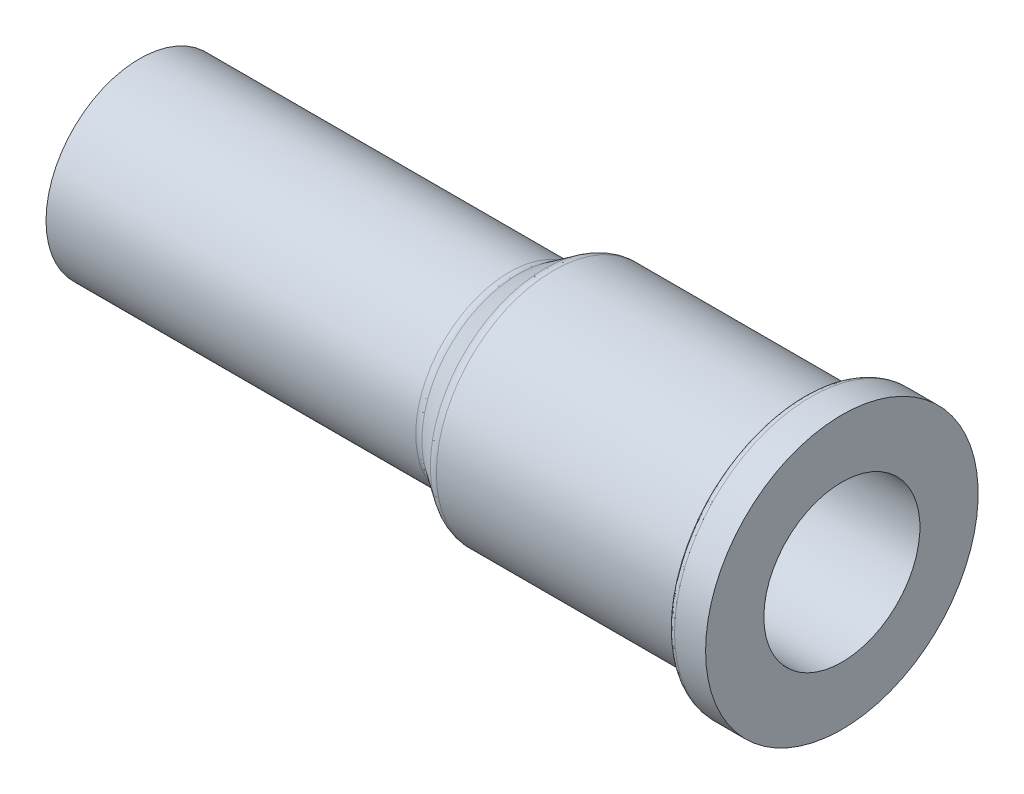
ISO-10303-21;
HEADER;
FILE_DESCRIPTION(('STEP AP214'),'2;1');
FILE_NAME('part.step','',(''),(''),'','','');
FILE_SCHEMA(('AUTOMOTIVE_DESIGN { 1 0 10303 214 1 1 1 1 }'));
ENDSEC;
DATA;
#1=APPLICATION_CONTEXT('core data for automotive mechanical design processes');
#2=APPLICATION_PROTOCOL_DEFINITION('international standard','automotive_design',2000,#1);
#3=PRODUCT_CONTEXT('',#1,'mechanical');
#4=PRODUCT('Part','Part','',(#3));
#5=PRODUCT_RELATED_PRODUCT_CATEGORY('part','',(#4));
#6=PRODUCT_DEFINITION_FORMATION('','',#4);
#7=PRODUCT_DEFINITION_CONTEXT('part definition',#1,'design');
#8=PRODUCT_DEFINITION('design','',#6,#7);
#9=PRODUCT_DEFINITION_SHAPE('','',#8);
#10=(LENGTH_UNIT() NAMED_UNIT(*) SI_UNIT(.MILLI.,.METRE.));
#11=(NAMED_UNIT(*) PLANE_ANGLE_UNIT() SI_UNIT($,.RADIAN.));
#12=(NAMED_UNIT(*) SI_UNIT($,.STERADIAN.) SOLID_ANGLE_UNIT());
#13=UNCERTAINTY_MEASURE_WITH_UNIT(LENGTH_MEASURE(1.E-05),#10,'distance_accuracy_value','');
#14=(GEOMETRIC_REPRESENTATION_CONTEXT(3) GLOBAL_UNCERTAINTY_ASSIGNED_CONTEXT((#13)) GLOBAL_UNIT_ASSIGNED_CONTEXT((#10,
#11,#12)) REPRESENTATION_CONTEXT('',''));
#15=CARTESIAN_POINT('',(0.,0.,0.));
#16=DIRECTION('',(0.,0.,1.));
#17=DIRECTION('',(1.,0.,0.));
#18=AXIS2_PLACEMENT_3D('',#15,#16,#17);
#19=CARTESIAN_POINT('',(-32.8420241202816,6.,0.));
#20=DIRECTION('',(1.,0.,0.));
#21=DIRECTION('',(0.,0.,-1.));
#22=AXIS2_PLACEMENT_3D('',#19,#20,#21);
#23=PLANE('',#22);
#24=CARTESIAN_POINT('',(-32.8420241202816,0.,0.));
#25=DIRECTION('',(-1.,0.,0.));
#26=DIRECTION('',(0.,0.,1.));
#27=AXIS2_PLACEMENT_3D('',#24,#25,#26);
#28=CIRCLE('',#27,5.);
#29=CARTESIAN_POINT('',(-32.8420241202816,0.,5.));
#30=VERTEX_POINT('',#29);
#31=EDGE_CURVE('E65',#30,#30,#28,.T.);
#32=ORIENTED_EDGE('',*,*,#31,.F.);
#33=EDGE_LOOP('',(#32));
#34=FACE_BOUND('',#33,.T.);
#35=CARTESIAN_POINT('',(-32.8420241202816,0.,0.));
#36=DIRECTION('',(-1.,0.,0.));
#37=DIRECTION('',(0.,0.,1.));
#38=AXIS2_PLACEMENT_3D('',#35,#36,#37);
#39=CIRCLE('',#38,6.);
#40=CARTESIAN_POINT('',(-32.8420241202816,0.,6.));
#41=VERTEX_POINT('',#40);
#42=EDGE_CURVE('E74',#41,#41,#39,.T.);
#43=ORIENTED_EDGE('',*,*,#42,.T.);
#44=EDGE_LOOP('',(#43));
#45=FACE_BOUND('',#44,.T.);
#46=ADVANCED_FACE('F33',(#34,#45),#23,.F.);
#47=CARTESIAN_POINT('',(-59.1357716089151,0.,0.));
#48=DIRECTION('',(-1.,0.,0.));
#49=DIRECTION('',(0.,0.,1.));
#50=AXIS2_PLACEMENT_3D('',#47,#48,#49);
#51=CYLINDRICAL_SURFACE('',#50,5.);
#52=CARTESIAN_POINT('',(12.1579758797184,0.,0.));
#53=DIRECTION('',(-1.,0.,0.));
#54=DIRECTION('',(0.,0.,1.));
#55=AXIS2_PLACEMENT_3D('',#52,#53,#54);
#56=CIRCLE('',#55,5.);
#57=CARTESIAN_POINT('',(12.1579758797184,0.,5.));
#58=VERTEX_POINT('',#57);
#59=EDGE_CURVE('E68',#58,#58,#56,.T.);
#60=ORIENTED_EDGE('',*,*,#59,.F.);
#61=EDGE_LOOP('',(#60));
#62=FACE_BOUND('',#61,.T.);
#63=ORIENTED_EDGE('',*,*,#31,.T.);
#64=EDGE_LOOP('',(#63));
#65=FACE_BOUND('',#64,.T.);
#66=ADVANCED_FACE('F94',(#62,#65),#51,.F.);
#67=CARTESIAN_POINT('',(12.1579758797184,8.73293337686565,0.));
#68=DIRECTION('',(-1.,0.,0.));
#69=DIRECTION('',(0.,0.,1.));
#70=AXIS2_PLACEMENT_3D('',#67,#68,#69);
#71=PLANE('',#70);
#72=CARTESIAN_POINT('',(12.1579758797184,0.,0.));
#73=DIRECTION('',(-1.,0.,0.));
#74=DIRECTION('',(0.,0.,1.));
#75=AXIS2_PLACEMENT_3D('',#72,#73,#74);
#76=CIRCLE('',#75,8.73293337686565);
#77=CARTESIAN_POINT('',(12.1579758797184,0.,8.73293337686565));
#78=VERTEX_POINT('',#77);
#79=EDGE_CURVE('E71',#78,#78,#76,.T.);
#80=ORIENTED_EDGE('',*,*,#79,.F.);
#81=EDGE_LOOP('',(#80));
#82=FACE_BOUND('',#81,.T.);
#83=ORIENTED_EDGE('',*,*,#59,.T.);
#84=EDGE_LOOP('',(#83));
#85=FACE_BOUND('',#84,.T.);
#86=ADVANCED_FACE('F100',(#82,#85),#71,.F.);
#87=CARTESIAN_POINT('',(-59.1357716089151,0.,0.));
#88=DIRECTION('',(-1.,0.,0.));
#89=DIRECTION('',(0.,0.,1.));
#90=AXIS2_PLACEMENT_3D('',#87,#88,#89);
#91=CYLINDRICAL_SURFACE('',#90,8.73293337686565);
#92=CARTESIAN_POINT('',(10.1653007787448,0.,0.));
#93=DIRECTION('',(1.,0.,0.));
#94=DIRECTION('',(0.,0.,-1.));
#95=AXIS2_PLACEMENT_3D('',#92,#93,#94);
#96=CIRCLE('',#95,8.73293337686565);
#97=CARTESIAN_POINT('',(10.1653007787448,0.,-8.73293337686565));
#98=VERTEX_POINT('',#97);
#99=EDGE_CURVE('E53',#98,#98,#96,.T.);
#100=ORIENTED_EDGE('',*,*,#99,.T.);
#101=EDGE_LOOP('',(#100));
#102=FACE_BOUND('',#101,.T.);
#103=ORIENTED_EDGE('',*,*,#79,.T.);
#104=EDGE_LOOP('',(#103));
#105=FACE_BOUND('',#104,.T.);
#106=ADVANCED_FACE('F129',(#102,#105),#91,.T.);
#107=CARTESIAN_POINT('',(9.81519700963991,0.,0.));
#108=DIRECTION('',(1.,0.,0.));
#109=DIRECTION('',(0.,0.,-1.));
#110=AXIS2_PLACEMENT_3D('',#107,#108,#109);
#111=CONICAL_SURFACE('',#110,8.73293337686565,1.22173047639603);
#112=CARTESIAN_POINT('',(9.69545446835181,0.,0.));
#113=DIRECTION('',(-1.,0.,0.));
#114=DIRECTION('',(0.,0.,1.));
#115=AXIS2_PLACEMENT_3D('',#112,#113,#114);
#116=CIRCLE('',#115,8.40394344852848);
#117=CARTESIAN_POINT('',(9.69545446835181,0.,8.40394344852848));
#118=VERTEX_POINT('',#117);
#119=EDGE_CURVE('E56',#118,#118,#116,.T.);
#120=ORIENTED_EDGE('',*,*,#119,.T.);
#121=EDGE_LOOP('',(#120));
#122=FACE_BOUND('',#121,.T.);
#123=CARTESIAN_POINT('',(9.4861885009156,0.,0.));
#124=DIRECTION('',(1.,0.,0.));
#125=DIRECTION('',(0.,0.,-1.));
#126=AXIS2_PLACEMENT_3D('',#123,#124,#125);
#127=CIRCLE('',#126,7.82898992833717);
#128=CARTESIAN_POINT('',(9.4861885009156,0.,-7.82898992833717));
#129=VERTEX_POINT('',#128);
#130=EDGE_CURVE('E59',#129,#129,#127,.T.);
#131=ORIENTED_EDGE('',*,*,#130,.T.);
#132=EDGE_LOOP('',(#131));
#133=FACE_BOUND('',#132,.T.);
#134=ADVANCED_FACE('F122',(#122,#133),#111,.T.);
#135=CARTESIAN_POINT('',(-59.1357716089151,0.,0.));
#136=DIRECTION('',(-1.,0.,0.));
#137=DIRECTION('',(0.,0.,1.));
#138=AXIS2_PLACEMENT_3D('',#135,#136,#137);
#139=CYLINDRICAL_SURFACE('',#138,7.5);
#140=CARTESIAN_POINT('',(-6.32606218247021,0.,0.));
#141=DIRECTION('',(1.,0.,0.));
#142=DIRECTION('',(0.,0.,-1.));
#143=AXIS2_PLACEMENT_3D('',#140,#141,#142);
#144=CIRCLE('',#143,7.5);
#145=CARTESIAN_POINT('',(-6.32606218247021,0.,-7.5));
#146=VERTEX_POINT('',#145);
#147=EDGE_CURVE('E44',#146,#146,#144,.T.);
#148=ORIENTED_EDGE('',*,*,#147,.T.);
#149=EDGE_LOOP('',(#148));
#150=FACE_BOUND('',#149,.T.);
#151=CARTESIAN_POINT('',(9.01634219052265,0.,0.));
#152=DIRECTION('',(-1.,0.,0.));
#153=DIRECTION('',(0.,0.,1.));
#154=AXIS2_PLACEMENT_3D('',#151,#152,#153);
#155=CIRCLE('',#154,7.5);
#156=CARTESIAN_POINT('',(9.01634219052265,0.,7.5));
#157=VERTEX_POINT('',#156);
#158=EDGE_CURVE('E62',#157,#157,#155,.T.);
#159=ORIENTED_EDGE('',*,*,#158,.T.);
#160=EDGE_LOOP('',(#159));
#161=FACE_BOUND('',#160,.T.);
#162=ADVANCED_FACE('F91',(#150,#161),#139,.T.);
#163=CARTESIAN_POINT('',(-6.6335540403725,0.,0.));
#164=DIRECTION('',(1.,0.,0.));
#165=DIRECTION('',(0.,0.,-1.));
#166=AXIS2_PLACEMENT_3D('',#163,#164,#165);
#167=CONICAL_SURFACE('',#166,7.5,0.596631615357143);
#168=CARTESIAN_POINT('',(-8.58765675056023,0.,0.));
#169=DIRECTION('',(1.,0.,0.));
#170=DIRECTION('',(0.,0.,-1.));
#171=AXIS2_PLACEMENT_3D('',#168,#169,#170);
#172=CIRCLE('',#171,6.17276713778154);
#173=CARTESIAN_POINT('',(-8.58765675056023,0.,-6.17276713778154));
#174=VERTEX_POINT('',#173);
#175=EDGE_CURVE('E10',#174,#174,#172,.T.);
#176=ORIENTED_EDGE('',*,*,#175,.T.);
#177=EDGE_LOOP('',(#176));
#178=FACE_BOUND('',#177,.T.);
#179=CARTESIAN_POINT('',(-6.88792141009387,0.,0.));
#180=DIRECTION('',(-1.,0.,0.));
#181=DIRECTION('',(0.,0.,1.));
#182=AXIS2_PLACEMENT_3D('',#179,#180,#181);
#183=CIRCLE('',#182,7.32723286221846);
#184=CARTESIAN_POINT('',(-6.88792141009387,0.,7.32723286221846));
#185=VERTEX_POINT('',#184);
#186=EDGE_CURVE('E48',#185,#185,#183,.T.);
#187=ORIENTED_EDGE('',*,*,#186,.T.);
#188=EDGE_LOOP('',(#187));
#189=FACE_BOUND('',#188,.T.);
#190=ADVANCED_FACE('F82',(#178,#189),#167,.T.);
#191=CARTESIAN_POINT('',(-59.1357716089151,0.,0.));
#192=DIRECTION('',(-1.,0.,0.));
#193=DIRECTION('',(0.,0.,1.));
#194=AXIS2_PLACEMENT_3D('',#191,#192,#193);
#195=CYLINDRICAL_SURFACE('',#194,6.);
#196=CARTESIAN_POINT('',(-9.14951597818389,0.,0.));
#197=DIRECTION('',(-1.,0.,0.));
#198=DIRECTION('',(0.,0.,1.));
#199=AXIS2_PLACEMENT_3D('',#196,#197,#198);
#200=CIRCLE('',#199,6.);
#201=CARTESIAN_POINT('',(-9.14951597818389,0.,6.));
#202=VERTEX_POINT('',#201);
#203=EDGE_CURVE('E40',#202,#202,#200,.T.);
#204=ORIENTED_EDGE('',*,*,#203,.T.);
#205=EDGE_LOOP('',(#204));
#206=FACE_BOUND('',#205,.T.);
#207=ORIENTED_EDGE('',*,*,#42,.F.);
#208=EDGE_LOOP('',(#207));
#209=FACE_BOUND('',#208,.T.);
#210=ADVANCED_FACE('F79',(#206,#209),#195,.T.);
#211=CARTESIAN_POINT('',(9.01634219052265,0.,0.));
#212=DIRECTION('',(-1.,0.,0.));
#213=DIRECTION('',(0.,0.,1.));
#214=AXIS2_PLACEMENT_3D('',#211,#212,#213);
#215=TOROIDAL_SURFACE('',#214,8.,0.5);
#216=ORIENTED_EDGE('',*,*,#130,.F.);
#217=EDGE_LOOP('',(#216));
#218=FACE_BOUND('',#217,.T.);
#219=ORIENTED_EDGE('',*,*,#158,.F.);
#220=EDGE_LOOP('',(#219));
#221=FACE_BOUND('',#220,.T.);
#222=ADVANCED_FACE('F81',(#218,#221),#215,.F.);
#223=CARTESIAN_POINT('',(10.1653007787448,0.,0.));
#224=DIRECTION('',(1.,0.,0.));
#225=DIRECTION('',(0.,0.,-1.));
#226=AXIS2_PLACEMENT_3D('',#223,#224,#225);
#227=TOROIDAL_SURFACE('',#226,8.23293337686565,0.5);
#228=ORIENTED_EDGE('',*,*,#99,.F.);
#229=EDGE_LOOP('',(#228));
#230=FACE_BOUND('',#229,.T.);
#231=ORIENTED_EDGE('',*,*,#119,.F.);
#232=EDGE_LOOP('',(#231));
#233=FACE_BOUND('',#232,.T.);
#234=ADVANCED_FACE('F88',(#230,#233),#227,.T.);
#235=CARTESIAN_POINT('',(-6.32606218247021,0.,0.));
#236=DIRECTION('',(1.,0.,0.));
#237=DIRECTION('',(0.,0.,-1.));
#238=AXIS2_PLACEMENT_3D('',#235,#236,#237);
#239=TOROIDAL_SURFACE('',#238,6.5,1.);
#240=ORIENTED_EDGE('',*,*,#147,.F.);
#241=EDGE_LOOP('',(#240));
#242=FACE_BOUND('',#241,.T.);
#243=ORIENTED_EDGE('',*,*,#186,.F.);
#244=EDGE_LOOP('',(#243));
#245=FACE_BOUND('',#244,.T.);
#246=ADVANCED_FACE('F107',(#242,#245),#239,.T.);
#247=CARTESIAN_POINT('',(-9.14951597818389,0.,0.));
#248=DIRECTION('',(-1.,0.,0.));
#249=DIRECTION('',(0.,0.,1.));
#250=AXIS2_PLACEMENT_3D('',#247,#248,#249);
#251=TOROIDAL_SURFACE('',#250,7.,1.);
#252=ORIENTED_EDGE('',*,*,#175,.F.);
#253=EDGE_LOOP('',(#252));
#254=FACE_BOUND('',#253,.T.);
#255=ORIENTED_EDGE('',*,*,#203,.F.);
#256=EDGE_LOOP('',(#255));
#257=FACE_BOUND('',#256,.T.);
#258=ADVANCED_FACE('F35',(#254,#257),#251,.F.);
#259=CLOSED_SHELL('',(#46,#66,#86,#106,#134,#162,#190,#210,#222,#234,#246,#258));
#260=MANIFOLD_SOLID_BREP('B2',#259);
#261=ADVANCED_BREP_SHAPE_REPRESENTATION('',(#18,#260),#14);
#262=SHAPE_DEFINITION_REPRESENTATION(#9,#261);
ENDSEC;
END-ISO-10303-21;
